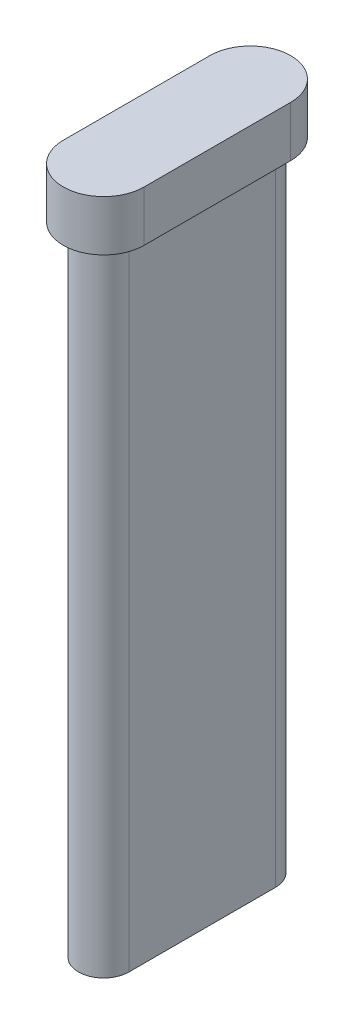
ISO-10303-21;
HEADER;
FILE_DESCRIPTION(('STEP AP214'),'2;1');
FILE_NAME('part.step','',(''),(''),'','','');
FILE_SCHEMA(('AUTOMOTIVE_DESIGN { 1 0 10303 214 1 1 1 1 }'));
ENDSEC;
DATA;
#1=APPLICATION_CONTEXT('core data for automotive mechanical design processes');
#2=APPLICATION_PROTOCOL_DEFINITION('international standard','automotive_design',2000,#1);
#3=PRODUCT_CONTEXT('',#1,'mechanical');
#4=PRODUCT('Part','Part','',(#3));
#5=PRODUCT_RELATED_PRODUCT_CATEGORY('part','',(#4));
#6=PRODUCT_DEFINITION_FORMATION('','',#4);
#7=PRODUCT_DEFINITION_CONTEXT('part definition',#1,'design');
#8=PRODUCT_DEFINITION('design','',#6,#7);
#9=PRODUCT_DEFINITION_SHAPE('','',#8);
#10=(LENGTH_UNIT() NAMED_UNIT(*) SI_UNIT(.MILLI.,.METRE.));
#11=(NAMED_UNIT(*) PLANE_ANGLE_UNIT() SI_UNIT($,.RADIAN.));
#12=(NAMED_UNIT(*) SI_UNIT($,.STERADIAN.) SOLID_ANGLE_UNIT());
#13=UNCERTAINTY_MEASURE_WITH_UNIT(LENGTH_MEASURE(1.E-05),#10,'distance_accuracy_value','');
#14=(GEOMETRIC_REPRESENTATION_CONTEXT(3) GLOBAL_UNCERTAINTY_ASSIGNED_CONTEXT((#13)) GLOBAL_UNIT_ASSIGNED_CONTEXT((#10,
#11,#12)) REPRESENTATION_CONTEXT('',''));
#15=CARTESIAN_POINT('',(0.,0.,0.));
#16=DIRECTION('',(0.,0.,1.));
#17=DIRECTION('',(1.,0.,0.));
#18=AXIS2_PLACEMENT_3D('',#15,#16,#17);
#19=CARTESIAN_POINT('',(0.,-68.,7.25));
#20=DIRECTION('',(0.,1.,0.));
#21=DIRECTION('',(0.,0.,1.));
#22=AXIS2_PLACEMENT_3D('',#19,#20,#21);
#23=CYLINDRICAL_SURFACE('',#22,2.5);
#24=DIRECTION('',(0.,1.,0.));
#25=VECTOR('',#24,1.);
#26=CARTESIAN_POINT('',(2.5,-68.,7.25));
#27=LINE('',#26,#25);
#28=CARTESIAN_POINT('',(2.5,-68.,7.25));
#29=VERTEX_POINT('',#28);
#30=CARTESIAN_POINT('',(2.5,-5.,7.25));
#31=VERTEX_POINT('',#30);
#32=EDGE_CURVE('E162',#29,#31,#27,.T.);
#33=ORIENTED_EDGE('',*,*,#32,.T.);
#34=CARTESIAN_POINT('',(0.,-5.,7.25));
#35=DIRECTION('',(0.,1.,0.));
#36=DIRECTION('',(0.,0.,1.));
#37=AXIS2_PLACEMENT_3D('',#34,#35,#36);
#38=CIRCLE('',#37,2.5);
#39=CARTESIAN_POINT('',(-2.5,-5.,7.25));
#40=VERTEX_POINT('',#39);
#41=EDGE_CURVE('E53',#31,#40,#38,.F.);
#42=ORIENTED_EDGE('',*,*,#41,.T.);
#43=DIRECTION('',(0.,1.,0.));
#44=VECTOR('',#43,1.);
#45=CARTESIAN_POINT('',(-2.5,-68.,7.25));
#46=LINE('',#45,#44);
#47=CARTESIAN_POINT('',(-2.5,-68.,7.25));
#48=VERTEX_POINT('',#47);
#49=EDGE_CURVE('E46',#48,#40,#46,.T.);
#50=ORIENTED_EDGE('',*,*,#49,.F.);
#51=CARTESIAN_POINT('',(0.,-68.,7.25));
#52=DIRECTION('',(0.,1.,0.));
#53=DIRECTION('',(0.,0.,1.));
#54=AXIS2_PLACEMENT_3D('',#51,#52,#53);
#55=CIRCLE('',#54,2.5);
#56=EDGE_CURVE('E151',#48,#29,#55,.T.);
#57=ORIENTED_EDGE('',*,*,#56,.T.);
#58=EDGE_LOOP('',(#33,#42,#50,#57));
#59=FACE_BOUND('',#58,.T.);
#60=ADVANCED_FACE('F39',(#59),#23,.T.);
#61=CARTESIAN_POINT('',(-2.5,-68.,7.25));
#62=DIRECTION('',(-1.,0.,0.));
#63=DIRECTION('',(0.,0.,1.));
#64=AXIS2_PLACEMENT_3D('',#61,#62,#63);
#65=PLANE('',#64);
#66=ORIENTED_EDGE('',*,*,#49,.T.);
#67=DIRECTION('',(0.,0.,-1.));
#68=VECTOR('',#67,1.);
#69=CARTESIAN_POINT('',(-2.5,-5.,7.25));
#70=LINE('',#69,#68);
#71=CARTESIAN_POINT('',(-2.5,-5.,-7.25));
#72=VERTEX_POINT('',#71);
#73=EDGE_CURVE('E147',#40,#72,#70,.T.);
#74=ORIENTED_EDGE('',*,*,#73,.T.);
#75=DIRECTION('',(0.,1.,0.));
#76=VECTOR('',#75,1.);
#77=CARTESIAN_POINT('',(-2.5,-68.,-7.25));
#78=LINE('',#77,#76);
#79=CARTESIAN_POINT('',(-2.5,-68.,-7.25));
#80=VERTEX_POINT('',#79);
#81=EDGE_CURVE('E164',#80,#72,#78,.T.);
#82=ORIENTED_EDGE('',*,*,#81,.F.);
#83=DIRECTION('',(0.,0.,1.));
#84=VECTOR('',#83,1.);
#85=CARTESIAN_POINT('',(-2.5,-68.,7.25));
#86=LINE('',#85,#84);
#87=EDGE_CURVE('E159',#80,#48,#86,.T.);
#88=ORIENTED_EDGE('',*,*,#87,.T.);
#89=EDGE_LOOP('',(#66,#74,#82,#88));
#90=FACE_BOUND('',#89,.T.);
#91=ADVANCED_FACE('F180',(#90),#65,.T.);
#92=CARTESIAN_POINT('',(0.,-68.,-7.25));
#93=DIRECTION('',(0.,1.,0.));
#94=DIRECTION('',(0.,0.,1.));
#95=AXIS2_PLACEMENT_3D('',#92,#93,#94);
#96=CYLINDRICAL_SURFACE('',#95,2.5);
#97=ORIENTED_EDGE('',*,*,#81,.T.);
#98=CARTESIAN_POINT('',(0.,-5.,-7.25));
#99=DIRECTION('',(0.,1.,0.));
#100=DIRECTION('',(0.,0.,1.));
#101=AXIS2_PLACEMENT_3D('',#98,#99,#100);
#102=CIRCLE('',#101,2.5);
#103=CARTESIAN_POINT('',(2.5,-5.,-7.25));
#104=VERTEX_POINT('',#103);
#105=EDGE_CURVE('E141',#72,#104,#102,.F.);
#106=ORIENTED_EDGE('',*,*,#105,.T.);
#107=DIRECTION('',(0.,1.,0.));
#108=VECTOR('',#107,1.);
#109=CARTESIAN_POINT('',(2.5,-68.,-7.25));
#110=LINE('',#109,#108);
#111=CARTESIAN_POINT('',(2.5,-68.,-7.25));
#112=VERTEX_POINT('',#111);
#113=EDGE_CURVE('E167',#112,#104,#110,.T.);
#114=ORIENTED_EDGE('',*,*,#113,.F.);
#115=CARTESIAN_POINT('',(0.,-68.,-7.25));
#116=DIRECTION('',(0.,1.,0.));
#117=DIRECTION('',(0.,0.,1.));
#118=AXIS2_PLACEMENT_3D('',#115,#116,#117);
#119=CIRCLE('',#118,2.5);
#120=EDGE_CURVE('E156',#112,#80,#119,.T.);
#121=ORIENTED_EDGE('',*,*,#120,.T.);
#122=EDGE_LOOP('',(#97,#106,#114,#121));
#123=FACE_BOUND('',#122,.T.);
#124=ADVANCED_FACE('F178',(#123),#96,.T.);
#125=CARTESIAN_POINT('',(2.5,-68.,7.25));
#126=DIRECTION('',(1.,0.,0.));
#127=DIRECTION('',(0.,0.,-1.));
#128=AXIS2_PLACEMENT_3D('',#125,#126,#127);
#129=PLANE('',#128);
#130=ORIENTED_EDGE('',*,*,#113,.T.);
#131=DIRECTION('',(0.,0.,1.));
#132=VECTOR('',#131,1.);
#133=CARTESIAN_POINT('',(2.5,-5.,7.25));
#134=LINE('',#133,#132);
#135=EDGE_CURVE('E11',#104,#31,#134,.T.);
#136=ORIENTED_EDGE('',*,*,#135,.T.);
#137=ORIENTED_EDGE('',*,*,#32,.F.);
#138=DIRECTION('',(0.,0.,-1.));
#139=VECTOR('',#138,1.);
#140=CARTESIAN_POINT('',(2.5,-68.,7.25));
#141=LINE('',#140,#139);
#142=EDGE_CURVE('E153',#29,#112,#141,.T.);
#143=ORIENTED_EDGE('',*,*,#142,.T.);
#144=EDGE_LOOP('',(#130,#136,#137,#143));
#145=FACE_BOUND('',#144,.T.);
#146=ADVANCED_FACE('F172',(#145),#129,.T.);
#147=CARTESIAN_POINT('',(0.,-68.,7.25));
#148=DIRECTION('',(0.,1.,0.));
#149=DIRECTION('',(0.,0.,1.));
#150=AXIS2_PLACEMENT_3D('',#147,#148,#149);
#151=PLANE('',#150);
#152=ORIENTED_EDGE('',*,*,#56,.F.);
#153=ORIENTED_EDGE('',*,*,#87,.F.);
#154=ORIENTED_EDGE('',*,*,#120,.F.);
#155=ORIENTED_EDGE('',*,*,#142,.F.);
#156=EDGE_LOOP('',(#152,#153,#154,#155));
#157=FACE_BOUND('',#156,.T.);
#158=ADVANCED_FACE('F175',(#157),#151,.F.);
#159=CARTESIAN_POINT('',(0.,-5.,7.25));
#160=DIRECTION('',(0.,1.,0.));
#161=DIRECTION('',(0.,0.,1.));
#162=AXIS2_PLACEMENT_3D('',#159,#160,#161);
#163=CYLINDRICAL_SURFACE('',#162,4.);
#164=CARTESIAN_POINT('',(0.,0.,7.25));
#165=DIRECTION('',(0.,1.,0.));
#166=DIRECTION('',(0.,0.,1.));
#167=AXIS2_PLACEMENT_3D('',#164,#165,#166);
#168=CIRCLE('',#167,4.);
#169=CARTESIAN_POINT('',(-4.,0.,7.25));
#170=VERTEX_POINT('',#169);
#171=CARTESIAN_POINT('',(4.,0.,7.25));
#172=VERTEX_POINT('',#171);
#173=EDGE_CURVE('E135',#170,#172,#168,.T.);
#174=ORIENTED_EDGE('',*,*,#173,.F.);
#175=DIRECTION('',(0.,1.,0.));
#176=VECTOR('',#175,1.);
#177=CARTESIAN_POINT('',(-4.,-5.,7.25));
#178=LINE('',#177,#176);
#179=CARTESIAN_POINT('',(-4.,-5.,7.25));
#180=VERTEX_POINT('',#179);
#181=EDGE_CURVE('E126',#180,#170,#178,.T.);
#182=ORIENTED_EDGE('',*,*,#181,.F.);
#183=CARTESIAN_POINT('',(0.,-5.,7.25));
#184=DIRECTION('',(0.,1.,0.));
#185=DIRECTION('',(0.,0.,1.));
#186=AXIS2_PLACEMENT_3D('',#183,#184,#185);
#187=CIRCLE('',#186,4.);
#188=CARTESIAN_POINT('',(4.,-5.,7.25));
#189=VERTEX_POINT('',#188);
#190=EDGE_CURVE('E120',#180,#189,#187,.T.);
#191=ORIENTED_EDGE('',*,*,#190,.T.);
#192=DIRECTION('',(0.,1.,0.));
#193=VECTOR('',#192,1.);
#194=CARTESIAN_POINT('',(4.,-5.,7.25));
#195=LINE('',#194,#193);
#196=EDGE_CURVE('E102',#189,#172,#195,.T.);
#197=ORIENTED_EDGE('',*,*,#196,.T.);
#198=EDGE_LOOP('',(#174,#182,#191,#197));
#199=FACE_BOUND('',#198,.T.);
#200=ADVANCED_FACE('F125',(#199),#163,.T.);
#201=CARTESIAN_POINT('',(-4.,-5.,-7.25));
#202=DIRECTION('',(-1.,0.,0.));
#203=DIRECTION('',(0.,0.,1.));
#204=AXIS2_PLACEMENT_3D('',#201,#202,#203);
#205=PLANE('',#204);
#206=DIRECTION('',(0.,0.,1.));
#207=VECTOR('',#206,1.);
#208=CARTESIAN_POINT('',(-4.,0.,-7.25));
#209=LINE('',#208,#207);
#210=CARTESIAN_POINT('',(-4.,0.,-7.25));
#211=VERTEX_POINT('',#210);
#212=EDGE_CURVE('E127',#211,#170,#209,.T.);
#213=ORIENTED_EDGE('',*,*,#212,.F.);
#214=DIRECTION('',(0.,1.,0.));
#215=VECTOR('',#214,1.);
#216=CARTESIAN_POINT('',(-4.,-5.,-7.25));
#217=LINE('',#216,#215);
#218=CARTESIAN_POINT('',(-4.,-5.,-7.25));
#219=VERTEX_POINT('',#218);
#220=EDGE_CURVE('E142',#219,#211,#217,.T.);
#221=ORIENTED_EDGE('',*,*,#220,.F.);
#222=DIRECTION('',(0.,0.,1.));
#223=VECTOR('',#222,1.);
#224=CARTESIAN_POINT('',(-4.,-5.,-7.25));
#225=LINE('',#224,#223);
#226=EDGE_CURVE('E113',#219,#180,#225,.T.);
#227=ORIENTED_EDGE('',*,*,#226,.T.);
#228=ORIENTED_EDGE('',*,*,#181,.T.);
#229=EDGE_LOOP('',(#213,#221,#227,#228));
#230=FACE_BOUND('',#229,.T.);
#231=ADVANCED_FACE('F198',(#230),#205,.T.);
#232=CARTESIAN_POINT('',(0.,-5.,-7.25));
#233=DIRECTION('',(0.,1.,0.));
#234=DIRECTION('',(0.,0.,1.));
#235=AXIS2_PLACEMENT_3D('',#232,#233,#234);
#236=CYLINDRICAL_SURFACE('',#235,4.);
#237=CARTESIAN_POINT('',(0.,0.,-7.25));
#238=DIRECTION('',(0.,1.,0.));
#239=DIRECTION('',(0.,0.,1.));
#240=AXIS2_PLACEMENT_3D('',#237,#238,#239);
#241=CIRCLE('',#240,4.);
#242=CARTESIAN_POINT('',(4.,0.,-7.25));
#243=VERTEX_POINT('',#242);
#244=EDGE_CURVE('E130',#243,#211,#241,.T.);
#245=ORIENTED_EDGE('',*,*,#244,.F.);
#246=DIRECTION('',(0.,1.,0.));
#247=VECTOR('',#246,1.);
#248=CARTESIAN_POINT('',(4.,-5.,-7.25));
#249=LINE('',#248,#247);
#250=CARTESIAN_POINT('',(4.,-5.,-7.25));
#251=VERTEX_POINT('',#250);
#252=EDGE_CURVE('E112',#251,#243,#249,.T.);
#253=ORIENTED_EDGE('',*,*,#252,.F.);
#254=CARTESIAN_POINT('',(0.,-5.,-7.25));
#255=DIRECTION('',(0.,1.,0.));
#256=DIRECTION('',(0.,0.,1.));
#257=AXIS2_PLACEMENT_3D('',#254,#255,#256);
#258=CIRCLE('',#257,4.);
#259=EDGE_CURVE('E123',#251,#219,#258,.T.);
#260=ORIENTED_EDGE('',*,*,#259,.T.);
#261=ORIENTED_EDGE('',*,*,#220,.T.);
#262=EDGE_LOOP('',(#245,#253,#260,#261));
#263=FACE_BOUND('',#262,.T.);
#264=ADVANCED_FACE('F203',(#263),#236,.T.);
#265=CARTESIAN_POINT('',(4.,-5.,7.25));
#266=DIRECTION('',(1.,0.,0.));
#267=DIRECTION('',(0.,0.,-1.));
#268=AXIS2_PLACEMENT_3D('',#265,#266,#267);
#269=PLANE('',#268);
#270=DIRECTION('',(0.,0.,-1.));
#271=VECTOR('',#270,1.);
#272=CARTESIAN_POINT('',(4.,0.,7.25));
#273=LINE('',#272,#271);
#274=EDGE_CURVE('E107',#172,#243,#273,.T.);
#275=ORIENTED_EDGE('',*,*,#274,.F.);
#276=ORIENTED_EDGE('',*,*,#196,.F.);
#277=DIRECTION('',(0.,0.,-1.));
#278=VECTOR('',#277,1.);
#279=CARTESIAN_POINT('',(4.,-5.,7.25));
#280=LINE('',#279,#278);
#281=EDGE_CURVE('E105',#189,#251,#280,.T.);
#282=ORIENTED_EDGE('',*,*,#281,.T.);
#283=ORIENTED_EDGE('',*,*,#252,.T.);
#284=EDGE_LOOP('',(#275,#276,#282,#283));
#285=FACE_BOUND('',#284,.T.);
#286=ADVANCED_FACE('F104',(#285),#269,.T.);
#287=CARTESIAN_POINT('',(0.,-5.,7.25));
#288=DIRECTION('',(0.,1.,0.));
#289=DIRECTION('',(0.,0.,1.));
#290=AXIS2_PLACEMENT_3D('',#287,#288,#289);
#291=PLANE('',#290);
#292=ORIENTED_EDGE('',*,*,#41,.F.);
#293=ORIENTED_EDGE('',*,*,#135,.F.);
#294=ORIENTED_EDGE('',*,*,#105,.F.);
#295=ORIENTED_EDGE('',*,*,#73,.F.);
#296=EDGE_LOOP('',(#292,#293,#294,#295));
#297=FACE_BOUND('',#296,.T.);
#298=ORIENTED_EDGE('',*,*,#190,.F.);
#299=ORIENTED_EDGE('',*,*,#226,.F.);
#300=ORIENTED_EDGE('',*,*,#259,.F.);
#301=ORIENTED_EDGE('',*,*,#281,.F.);
#302=EDGE_LOOP('',(#298,#299,#300,#301));
#303=FACE_BOUND('',#302,.T.);
#304=ADVANCED_FACE('F118',(#297,#303),#291,.F.);
#305=CARTESIAN_POINT('',(0.,0.,7.25));
#306=DIRECTION('',(0.,1.,0.));
#307=DIRECTION('',(0.,0.,1.));
#308=AXIS2_PLACEMENT_3D('',#305,#306,#307);
#309=PLANE('',#308);
#310=ORIENTED_EDGE('',*,*,#173,.T.);
#311=ORIENTED_EDGE('',*,*,#274,.T.);
#312=ORIENTED_EDGE('',*,*,#244,.T.);
#313=ORIENTED_EDGE('',*,*,#212,.T.);
#314=EDGE_LOOP('',(#310,#311,#312,#313));
#315=FACE_BOUND('',#314,.T.);
#316=ADVANCED_FACE('F189',(#315),#309,.T.);
#317=CLOSED_SHELL('',(#60,#91,#124,#146,#158,#200,#231,#264,#286,#304,#316));
#318=MANIFOLD_SOLID_BREP('B2',#317);
#319=ADVANCED_BREP_SHAPE_REPRESENTATION('',(#18,#318),#14);
#320=SHAPE_DEFINITION_REPRESENTATION(#9,#319);
ENDSEC;
END-ISO-10303-21;
